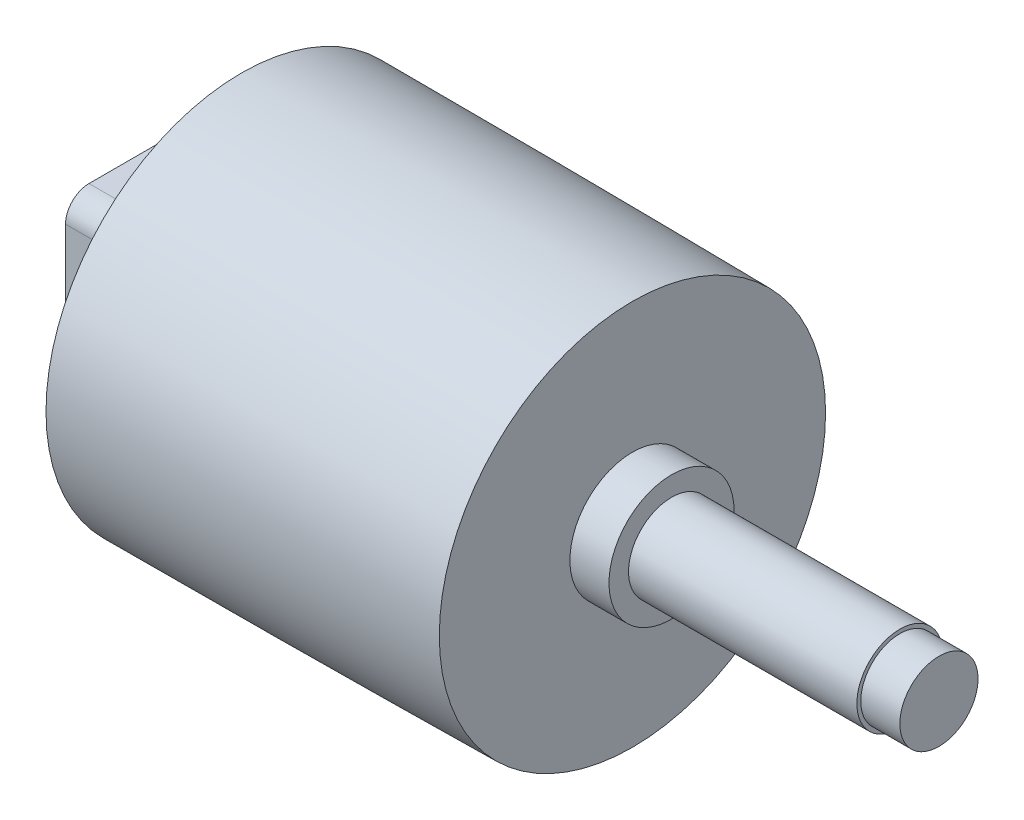
ISO-10303-21;
HEADER;
FILE_DESCRIPTION(('STEP AP214'),'2;1');
FILE_NAME('part.step','',(''),(''),'','','');
FILE_SCHEMA(('AUTOMOTIVE_DESIGN { 1 0 10303 214 1 1 1 1 }'));
ENDSEC;
DATA;
#1=APPLICATION_CONTEXT('core data for automotive mechanical design processes');
#2=APPLICATION_PROTOCOL_DEFINITION('international standard','automotive_design',2000,#1);
#3=PRODUCT_CONTEXT('',#1,'mechanical');
#4=PRODUCT('Part','Part','',(#3));
#5=PRODUCT_RELATED_PRODUCT_CATEGORY('part','',(#4));
#6=PRODUCT_DEFINITION_FORMATION('','',#4);
#7=PRODUCT_DEFINITION_CONTEXT('part definition',#1,'design');
#8=PRODUCT_DEFINITION('design','',#6,#7);
#9=PRODUCT_DEFINITION_SHAPE('','',#8);
#10=(LENGTH_UNIT() NAMED_UNIT(*) SI_UNIT(.MILLI.,.METRE.));
#11=(NAMED_UNIT(*) PLANE_ANGLE_UNIT() SI_UNIT($,.RADIAN.));
#12=(NAMED_UNIT(*) SI_UNIT($,.STERADIAN.) SOLID_ANGLE_UNIT());
#13=UNCERTAINTY_MEASURE_WITH_UNIT(LENGTH_MEASURE(1.E-05),#10,'distance_accuracy_value','');
#14=(GEOMETRIC_REPRESENTATION_CONTEXT(3) GLOBAL_UNCERTAINTY_ASSIGNED_CONTEXT((#13)) GLOBAL_UNIT_ASSIGNED_CONTEXT((#10,
#11,#12)) REPRESENTATION_CONTEXT('',''));
#15=CARTESIAN_POINT('',(0.,0.,0.));
#16=DIRECTION('',(0.,0.,1.));
#17=DIRECTION('',(1.,0.,0.));
#18=AXIS2_PLACEMENT_3D('',#15,#16,#17);
#19=CARTESIAN_POINT('',(-76.9950755436057,8.24786516853933,0.));
#20=DIRECTION('',(1.,0.,0.));
#21=DIRECTION('',(0.,0.,-1.));
#22=AXIS2_PLACEMENT_3D('',#19,#20,#21);
#23=PLANE('',#22);
#24=CARTESIAN_POINT('',(-76.9950755436057,8.24786516853933,0.));
#25=DIRECTION('',(1.,0.,0.));
#26=DIRECTION('',(0.,0.,-1.));
#27=AXIS2_PLACEMENT_3D('',#24,#25,#26);
#28=CIRCLE('',#27,25.);
#29=CARTESIAN_POINT('',(-76.9950755436057,8.24786516853933,-25.));
#30=VERTEX_POINT('',#29);
#31=EDGE_CURVE('E121',#30,#30,#28,.T.);
#32=ORIENTED_EDGE('',*,*,#31,.F.);
#33=EDGE_LOOP('',(#32));
#34=FACE_BOUND('',#33,.T.);
#35=CARTESIAN_POINT('',(-76.9950755436057,-1.25213483146068,9.50000000000001));
#36=DIRECTION('',(-1.,0.,0.));
#37=DIRECTION('',(0.,0.,1.));
#38=AXIS2_PLACEMENT_3D('',#35,#36,#37);
#39=CIRCLE('',#38,3.);
#40=CARTESIAN_POINT('',(-76.9950755436057,-4.25213483146068,9.49999999999998));
#41=VERTEX_POINT('',#40);
#42=CARTESIAN_POINT('',(-76.9950755436057,-1.25213483146065,12.5));
#43=VERTEX_POINT('',#42);
#44=EDGE_CURVE('E51',#41,#43,#39,.T.);
#45=ORIENTED_EDGE('',*,*,#44,.F.);
#46=DIRECTION('',(0.,0.,1.));
#47=VECTOR('',#46,1.);
#48=CARTESIAN_POINT('',(-76.9950755436057,-4.25213483146068,-9.49999999999998));
#49=LINE('',#48,#47);
#50=CARTESIAN_POINT('',(-76.9950755436057,-4.25213483146068,-9.49999999999998));
#51=VERTEX_POINT('',#50);
#52=EDGE_CURVE('E55',#51,#41,#49,.T.);
#53=ORIENTED_EDGE('',*,*,#52,.F.);
#54=CARTESIAN_POINT('',(-76.9950755436057,-1.25213483146068,-9.5));
#55=DIRECTION('',(-1.,0.,0.));
#56=DIRECTION('',(0.,0.,1.));
#57=AXIS2_PLACEMENT_3D('',#54,#55,#56);
#58=CIRCLE('',#57,3.);
#59=CARTESIAN_POINT('',(-76.9950755436057,-1.25213483146065,-12.5));
#60=VERTEX_POINT('',#59);
#61=EDGE_CURVE('E337',#60,#51,#58,.T.);
#62=ORIENTED_EDGE('',*,*,#61,.F.);
#63=DIRECTION('',(0.,-1.,0.));
#64=VECTOR('',#63,1.);
#65=CARTESIAN_POINT('',(-76.9950755436057,17.7478651685393,-12.5));
#66=LINE('',#65,#64);
#67=CARTESIAN_POINT('',(-76.9950755436057,17.7478651685393,-12.5));
#68=VERTEX_POINT('',#67);
#69=EDGE_CURVE('E371',#68,#60,#66,.T.);
#70=ORIENTED_EDGE('',*,*,#69,.F.);
#71=CARTESIAN_POINT('',(-76.9950755436057,17.7478651685393,-9.50000000000001));
#72=DIRECTION('',(-1.,0.,0.));
#73=DIRECTION('',(0.,0.,1.));
#74=AXIS2_PLACEMENT_3D('',#71,#72,#73);
#75=CIRCLE('',#74,3.);
#76=CARTESIAN_POINT('',(-76.9950755436057,20.7478651685393,-9.49999999999998));
#77=VERTEX_POINT('',#76);
#78=EDGE_CURVE('E364',#77,#68,#75,.T.);
#79=ORIENTED_EDGE('',*,*,#78,.F.);
#80=DIRECTION('',(0.,0.,-1.));
#81=VECTOR('',#80,1.);
#82=CARTESIAN_POINT('',(-76.9950755436057,20.7478651685393,-9.49999999999998));
#83=LINE('',#82,#81);
#84=CARTESIAN_POINT('',(-76.9950755436057,20.7478651685393,9.49999999999998));
#85=VERTEX_POINT('',#84);
#86=EDGE_CURVE('E358',#85,#77,#83,.T.);
#87=ORIENTED_EDGE('',*,*,#86,.F.);
#88=CARTESIAN_POINT('',(-76.9950755436057,17.7478651685393,9.5));
#89=DIRECTION('',(-1.,0.,0.));
#90=DIRECTION('',(0.,0.,-1.));
#91=AXIS2_PLACEMENT_3D('',#88,#89,#90);
#92=CIRCLE('',#91,3.);
#93=CARTESIAN_POINT('',(-76.9950755436057,17.7478651685393,12.5));
#94=VERTEX_POINT('',#93);
#95=EDGE_CURVE('E361',#94,#85,#92,.T.);
#96=ORIENTED_EDGE('',*,*,#95,.F.);
#97=DIRECTION('',(0.,1.,0.));
#98=VECTOR('',#97,1.);
#99=CARTESIAN_POINT('',(-76.9950755436057,17.7478651685393,12.5));
#100=LINE('',#99,#98);
#101=EDGE_CURVE('E362',#43,#94,#100,.T.);
#102=ORIENTED_EDGE('',*,*,#101,.F.);
#103=EDGE_LOOP('',(#45,#53,#62,#70,#79,#87,#96,#102));
#104=FACE_BOUND('',#103,.T.);
#105=ADVANCED_FACE('F35',(#34,#104),#23,.F.);
#106=CARTESIAN_POINT('',(-26.9950755436057,8.24786516853933,0.));
#107=DIRECTION('',(1.,0.,0.));
#108=DIRECTION('',(0.,0.617753922452919,-0.786371471566735));
#109=AXIS2_PLACEMENT_3D('',#106,#107,#108);
#110=CYLINDRICAL_SURFACE('',#109,5.5);
#111=CARTESIAN_POINT('',(7.20492445639428,8.24786516853933,0.));
#112=DIRECTION('',(-1.,0.,0.));
#113=DIRECTION('',(0.,-0.617753922452919,0.786371471566735));
#114=AXIS2_PLACEMENT_3D('',#111,#112,#113);
#115=CIRCLE('',#114,5.5);
#116=CARTESIAN_POINT('',(7.20492445639428,4.85021859504827,4.32504309361704));
#117=VERTEX_POINT('',#116);
#118=EDGE_CURVE('E139',#117,#117,#115,.T.);
#119=ORIENTED_EDGE('',*,*,#118,.T.);
#120=EDGE_LOOP('',(#119));
#121=FACE_BOUND('',#120,.T.);
#122=CARTESIAN_POINT('',(-21.9950755436057,8.24786516853933,0.));
#123=DIRECTION('',(-1.,0.,0.));
#124=DIRECTION('',(0.,-0.617753922452919,0.786371471566735));
#125=AXIS2_PLACEMENT_3D('',#122,#123,#124);
#126=CIRCLE('',#125,5.5);
#127=CARTESIAN_POINT('',(-21.9950755436057,4.85021859504827,4.32504309361704));
#128=VERTEX_POINT('',#127);
#129=EDGE_CURVE('E39',#128,#128,#126,.T.);
#130=ORIENTED_EDGE('',*,*,#129,.F.);
#131=EDGE_LOOP('',(#130));
#132=FACE_BOUND('',#131,.T.);
#133=ADVANCED_FACE('F37',(#121,#132),#110,.T.);
#134=CARTESIAN_POINT('',(7.20492445639428,8.24786516853933,0.));
#135=DIRECTION('',(-1.,0.,0.));
#136=DIRECTION('',(0.,-0.617753922452919,0.786371471566735));
#137=AXIS2_PLACEMENT_3D('',#134,#135,#136);
#138=PLANE('',#137);
#139=CARTESIAN_POINT('',(7.20492445639428,8.24786516853933,0.));
#140=DIRECTION('',(1.,0.,0.));
#141=DIRECTION('',(0.,0.617753922452919,-0.786371471566735));
#142=AXIS2_PLACEMENT_3D('',#139,#140,#141);
#143=CIRCLE('',#142,5.);
#144=CARTESIAN_POINT('',(7.20492445639428,11.3366347808039,-3.93185735783368));
#145=VERTEX_POINT('',#144);
#146=EDGE_CURVE('E11',#145,#145,#143,.T.);
#147=ORIENTED_EDGE('',*,*,#146,.F.);
#148=EDGE_LOOP('',(#147));
#149=FACE_BOUND('',#148,.T.);
#150=ORIENTED_EDGE('',*,*,#118,.F.);
#151=EDGE_LOOP('',(#150));
#152=FACE_BOUND('',#151,.T.);
#153=ADVANCED_FACE('F151',(#149,#152),#138,.F.);
#154=CARTESIAN_POINT('',(-21.9950755436057,8.24786516853933,0.));
#155=DIRECTION('',(-1.,0.,0.));
#156=DIRECTION('',(0.,-0.617753922452919,0.786371471566735));
#157=AXIS2_PLACEMENT_3D('',#154,#155,#156);
#158=CYLINDRICAL_SURFACE('',#157,8.);
#159=CARTESIAN_POINT('',(-21.9950755436057,8.24786516853933,0.));
#160=DIRECTION('',(-1.,0.,0.));
#161=DIRECTION('',(0.,-0.617753922452919,0.786371471566735));
#162=AXIS2_PLACEMENT_3D('',#159,#160,#161);
#163=CIRCLE('',#162,8.);
#164=CARTESIAN_POINT('',(-21.9950755436057,3.30583378891597,6.29097177253388));
#165=VERTEX_POINT('',#164);
#166=EDGE_CURVE('E136',#165,#165,#163,.T.);
#167=ORIENTED_EDGE('',*,*,#166,.T.);
#168=EDGE_LOOP('',(#167));
#169=FACE_BOUND('',#168,.T.);
#170=CARTESIAN_POINT('',(-26.9950755436057,8.24786516853933,0.));
#171=DIRECTION('',(-1.,0.,0.));
#172=DIRECTION('',(0.,-0.617753922452919,0.786371471566735));
#173=AXIS2_PLACEMENT_3D('',#170,#171,#172);
#174=CIRCLE('',#173,8.);
#175=CARTESIAN_POINT('',(-26.9950755436057,3.30583378891597,6.29097177253388));
#176=VERTEX_POINT('',#175);
#177=EDGE_CURVE('E134',#176,#176,#174,.T.);
#178=ORIENTED_EDGE('',*,*,#177,.F.);
#179=EDGE_LOOP('',(#178));
#180=FACE_BOUND('',#179,.T.);
#181=ADVANCED_FACE('F156',(#169,#180),#158,.T.);
#182=CARTESIAN_POINT('',(-21.9950755436057,8.24786516853933,0.));
#183=DIRECTION('',(-1.,0.,0.));
#184=DIRECTION('',(0.,-0.617753922452919,0.786371471566735));
#185=AXIS2_PLACEMENT_3D('',#182,#183,#184);
#186=PLANE('',#185);
#187=ORIENTED_EDGE('',*,*,#129,.T.);
#188=EDGE_LOOP('',(#187));
#189=FACE_BOUND('',#188,.T.);
#190=ORIENTED_EDGE('',*,*,#166,.F.);
#191=EDGE_LOOP('',(#190));
#192=FACE_BOUND('',#191,.T.);
#193=ADVANCED_FACE('F147',(#189,#192),#186,.F.);
#194=CARTESIAN_POINT('',(12.2049244563943,8.24786516853933,0.));
#195=DIRECTION('',(-1.,0.,0.));
#196=DIRECTION('',(0.,-0.617753922452919,0.786371471566735));
#197=AXIS2_PLACEMENT_3D('',#194,#195,#196);
#198=CYLINDRICAL_SURFACE('',#197,5.);
#199=CARTESIAN_POINT('',(12.2049244563943,8.24786516853933,0.));
#200=DIRECTION('',(1.,0.,0.));
#201=DIRECTION('',(0.,0.617753922452919,-0.786371471566735));
#202=AXIS2_PLACEMENT_3D('',#199,#200,#201);
#203=CIRCLE('',#202,5.);
#204=CARTESIAN_POINT('',(12.2049244563943,11.3366347808039,-3.93185735783368));
#205=VERTEX_POINT('',#204);
#206=EDGE_CURVE('E132',#205,#205,#203,.T.);
#207=ORIENTED_EDGE('',*,*,#206,.F.);
#208=EDGE_LOOP('',(#207));
#209=FACE_BOUND('',#208,.T.);
#210=ORIENTED_EDGE('',*,*,#146,.T.);
#211=EDGE_LOOP('',(#210));
#212=FACE_BOUND('',#211,.T.);
#213=ADVANCED_FACE('F173',(#209,#212),#198,.T.);
#214=CARTESIAN_POINT('',(12.2049244563943,8.24786516853933,0.));
#215=DIRECTION('',(1.,0.,0.));
#216=DIRECTION('',(0.,0.617753922452919,-0.786371471566735));
#217=AXIS2_PLACEMENT_3D('',#214,#215,#216);
#218=PLANE('',#217);
#219=ORIENTED_EDGE('',*,*,#206,.T.);
#220=EDGE_LOOP('',(#219));
#221=FACE_BOUND('',#220,.T.);
#222=ADVANCED_FACE('F170',(#221),#218,.T.);
#223=CARTESIAN_POINT('',(-26.9950755436057,30.2478651685393,0.));
#224=DIRECTION('',(-1.,0.,0.));
#225=DIRECTION('',(0.,0.,1.));
#226=AXIS2_PLACEMENT_3D('',#223,#224,#225);
#227=PLANE('',#226);
#228=ORIENTED_EDGE('',*,*,#177,.T.);
#229=EDGE_LOOP('',(#228));
#230=FACE_BOUND('',#229,.T.);
#231=CARTESIAN_POINT('',(-26.9950755436056,8.24786516853933,0.));
#232=DIRECTION('',(-1.,0.,0.));
#233=DIRECTION('',(0.,-1.,0.));
#234=AXIS2_PLACEMENT_3D('',#231,#232,#233);
#235=CIRCLE('',#234,24.7000000000002);
#236=CARTESIAN_POINT('',(-26.9950755436056,-16.4521348314608,0.));
#237=VERTEX_POINT('',#236);
#238=EDGE_CURVE('E124',#237,#237,#235,.T.);
#239=ORIENTED_EDGE('',*,*,#238,.F.);
#240=EDGE_LOOP('',(#239));
#241=FACE_BOUND('',#240,.T.);
#242=ADVANCED_FACE('F168',(#230,#241),#227,.F.);
#243=CARTESIAN_POINT('',(-76.9950755436057,8.24786516853933,0.));
#244=DIRECTION('',(-1.,0.,0.));
#245=DIRECTION('',(0.,-1.,0.));
#246=AXIS2_PLACEMENT_3D('',#243,#244,#245);
#247=DEGENERATE_TOROIDAL_SURFACE('',#246,4141.81666666664,4166.81666666664,.F.);
#248=ORIENTED_EDGE('',*,*,#31,.T.);
#249=EDGE_LOOP('',(#248));
#250=FACE_BOUND('',#249,.T.);
#251=ORIENTED_EDGE('',*,*,#238,.T.);
#252=EDGE_LOOP('',(#251));
#253=FACE_BOUND('',#252,.T.);
#254=ADVANCED_FACE('F191',(#250,#253),#247,.F.);
#255=CARTESIAN_POINT('',(-86.9950755436057,-1.25213483146068,9.50000000000001));
#256=DIRECTION('',(1.,0.,0.));
#257=DIRECTION('',(0.,0.,-1.));
#258=AXIS2_PLACEMENT_3D('',#255,#256,#257);
#259=CYLINDRICAL_SURFACE('',#258,3.);
#260=ORIENTED_EDGE('',*,*,#44,.T.);
#261=DIRECTION('',(1.,0.,0.));
#262=VECTOR('',#261,1.);
#263=CARTESIAN_POINT('',(-86.9950755436057,-1.25213483146065,12.5));
#264=LINE('',#263,#262);
#265=CARTESIAN_POINT('',(-86.9950755436057,-1.25213483146065,12.5));
#266=VERTEX_POINT('',#265);
#267=EDGE_CURVE('E104',#266,#43,#264,.T.);
#268=ORIENTED_EDGE('',*,*,#267,.F.);
#269=CARTESIAN_POINT('',(-86.9950755436057,-1.25213483146068,9.50000000000001));
#270=DIRECTION('',(-1.,0.,0.));
#271=DIRECTION('',(0.,0.,1.));
#272=AXIS2_PLACEMENT_3D('',#269,#270,#271);
#273=CIRCLE('',#272,3.);
#274=CARTESIAN_POINT('',(-86.9950755436057,-4.25213483146068,9.49999999999998));
#275=VERTEX_POINT('',#274);
#276=EDGE_CURVE('E110',#275,#266,#273,.T.);
#277=ORIENTED_EDGE('',*,*,#276,.F.);
#278=DIRECTION('',(1.,0.,0.));
#279=VECTOR('',#278,1.);
#280=CARTESIAN_POINT('',(-86.9950755436057,-4.25213483146068,9.49999999999998));
#281=LINE('',#280,#279);
#282=EDGE_CURVE('E334',#275,#41,#281,.T.);
#283=ORIENTED_EDGE('',*,*,#282,.T.);
#284=EDGE_LOOP('',(#260,#268,#277,#283));
#285=FACE_BOUND('',#284,.T.);
#286=ADVANCED_FACE('F120',(#285),#259,.T.);
#287=CARTESIAN_POINT('',(-86.9950755436057,17.7478651685393,12.5));
#288=DIRECTION('',(0.,0.,-1.));
#289=DIRECTION('',(0.,1.,0.));
#290=AXIS2_PLACEMENT_3D('',#287,#288,#289);
#291=PLANE('',#290);
#292=ORIENTED_EDGE('',*,*,#101,.T.);
#293=DIRECTION('',(1.,0.,0.));
#294=VECTOR('',#293,1.);
#295=CARTESIAN_POINT('',(-86.9950755436057,17.7478651685393,12.5));
#296=LINE('',#295,#294);
#297=CARTESIAN_POINT('',(-86.9950755436057,17.7478651685393,12.5));
#298=VERTEX_POINT('',#297);
#299=EDGE_CURVE('E106',#298,#94,#296,.T.);
#300=ORIENTED_EDGE('',*,*,#299,.F.);
#301=DIRECTION('',(0.,1.,0.));
#302=VECTOR('',#301,1.);
#303=CARTESIAN_POINT('',(-86.9950755436057,17.7478651685393,12.5));
#304=LINE('',#303,#302);
#305=EDGE_CURVE('E99',#266,#298,#304,.T.);
#306=ORIENTED_EDGE('',*,*,#305,.F.);
#307=ORIENTED_EDGE('',*,*,#267,.T.);
#308=EDGE_LOOP('',(#292,#300,#306,#307));
#309=FACE_BOUND('',#308,.T.);
#310=ADVANCED_FACE('F102',(#309),#291,.F.);
#311=CARTESIAN_POINT('',(-86.9950755436057,17.7478651685393,9.5));
#312=DIRECTION('',(1.,0.,0.));
#313=DIRECTION('',(0.,0.,-1.));
#314=AXIS2_PLACEMENT_3D('',#311,#312,#313);
#315=CYLINDRICAL_SURFACE('',#314,3.);
#316=ORIENTED_EDGE('',*,*,#95,.T.);
#317=DIRECTION('',(1.,0.,0.));
#318=VECTOR('',#317,1.);
#319=CARTESIAN_POINT('',(-86.9950755436057,20.7478651685393,9.49999999999998));
#320=LINE('',#319,#318);
#321=CARTESIAN_POINT('',(-86.9950755436057,20.7478651685393,9.49999999999998));
#322=VERTEX_POINT('',#321);
#323=EDGE_CURVE('E126',#322,#85,#320,.T.);
#324=ORIENTED_EDGE('',*,*,#323,.F.);
#325=CARTESIAN_POINT('',(-86.9950755436057,17.7478651685393,9.5));
#326=DIRECTION('',(-1.,0.,0.));
#327=DIRECTION('',(0.,0.,-1.));
#328=AXIS2_PLACEMENT_3D('',#325,#326,#327);
#329=CIRCLE('',#328,3.);
#330=EDGE_CURVE('E109',#298,#322,#329,.T.);
#331=ORIENTED_EDGE('',*,*,#330,.F.);
#332=ORIENTED_EDGE('',*,*,#299,.T.);
#333=EDGE_LOOP('',(#316,#324,#331,#332));
#334=FACE_BOUND('',#333,.T.);
#335=ADVANCED_FACE('F202',(#334),#315,.T.);
#336=CARTESIAN_POINT('',(-86.9950755436057,20.7478651685393,-9.49999999999998));
#337=DIRECTION('',(0.,-1.,0.));
#338=DIRECTION('',(0.,0.,-1.));
#339=AXIS2_PLACEMENT_3D('',#336,#337,#338);
#340=PLANE('',#339);
#341=ORIENTED_EDGE('',*,*,#86,.T.);
#342=DIRECTION('',(1.,0.,0.));
#343=VECTOR('',#342,1.);
#344=CARTESIAN_POINT('',(-86.9950755436057,20.7478651685393,-9.49999999999998));
#345=LINE('',#344,#343);
#346=CARTESIAN_POINT('',(-86.9950755436057,20.7478651685393,-9.49999999999998));
#347=VERTEX_POINT('',#346);
#348=EDGE_CURVE('E351',#347,#77,#345,.T.);
#349=ORIENTED_EDGE('',*,*,#348,.F.);
#350=DIRECTION('',(0.,0.,-1.));
#351=VECTOR('',#350,1.);
#352=CARTESIAN_POINT('',(-86.9950755436057,20.7478651685393,-9.49999999999998));
#353=LINE('',#352,#351);
#354=EDGE_CURVE('E359',#322,#347,#353,.T.);
#355=ORIENTED_EDGE('',*,*,#354,.F.);
#356=ORIENTED_EDGE('',*,*,#323,.T.);
#357=EDGE_LOOP('',(#341,#349,#355,#356));
#358=FACE_BOUND('',#357,.T.);
#359=ADVANCED_FACE('F205',(#358),#340,.F.);
#360=CARTESIAN_POINT('',(-86.9950755436057,17.7478651685393,-9.50000000000001));
#361=DIRECTION('',(1.,0.,0.));
#362=DIRECTION('',(0.,0.,-1.));
#363=AXIS2_PLACEMENT_3D('',#360,#361,#362);
#364=CYLINDRICAL_SURFACE('',#363,3.);
#365=ORIENTED_EDGE('',*,*,#78,.T.);
#366=DIRECTION('',(1.,0.,0.));
#367=VECTOR('',#366,1.);
#368=CARTESIAN_POINT('',(-86.9950755436057,17.7478651685393,-12.5));
#369=LINE('',#368,#367);
#370=CARTESIAN_POINT('',(-86.9950755436057,17.7478651685393,-12.5));
#371=VERTEX_POINT('',#370);
#372=EDGE_CURVE('E348',#371,#68,#369,.T.);
#373=ORIENTED_EDGE('',*,*,#372,.F.);
#374=CARTESIAN_POINT('',(-86.9950755436057,17.7478651685393,-9.50000000000001));
#375=DIRECTION('',(-1.,0.,0.));
#376=DIRECTION('',(0.,0.,1.));
#377=AXIS2_PLACEMENT_3D('',#374,#375,#376);
#378=CIRCLE('',#377,3.);
#379=EDGE_CURVE('E379',#347,#371,#378,.T.);
#380=ORIENTED_EDGE('',*,*,#379,.F.);
#381=ORIENTED_EDGE('',*,*,#348,.T.);
#382=EDGE_LOOP('',(#365,#373,#380,#381));
#383=FACE_BOUND('',#382,.T.);
#384=ADVANCED_FACE('F209',(#383),#364,.T.);
#385=CARTESIAN_POINT('',(-86.9950755436057,17.7478651685393,-12.5));
#386=DIRECTION('',(0.,0.,1.));
#387=DIRECTION('',(0.,-1.,0.));
#388=AXIS2_PLACEMENT_3D('',#385,#386,#387);
#389=PLANE('',#388);
#390=ORIENTED_EDGE('',*,*,#69,.T.);
#391=DIRECTION('',(1.,0.,0.));
#392=VECTOR('',#391,1.);
#393=CARTESIAN_POINT('',(-86.9950755436057,-1.25213483146065,-12.5));
#394=LINE('',#393,#392);
#395=CARTESIAN_POINT('',(-86.9950755436057,-1.25213483146065,-12.5));
#396=VERTEX_POINT('',#395);
#397=EDGE_CURVE('E340',#396,#60,#394,.T.);
#398=ORIENTED_EDGE('',*,*,#397,.F.);
#399=DIRECTION('',(0.,-1.,0.));
#400=VECTOR('',#399,1.);
#401=CARTESIAN_POINT('',(-86.9950755436057,17.7478651685393,-12.5));
#402=LINE('',#401,#400);
#403=EDGE_CURVE('E377',#371,#396,#402,.T.);
#404=ORIENTED_EDGE('',*,*,#403,.F.);
#405=ORIENTED_EDGE('',*,*,#372,.T.);
#406=EDGE_LOOP('',(#390,#398,#404,#405));
#407=FACE_BOUND('',#406,.T.);
#408=ADVANCED_FACE('F213',(#407),#389,.F.);
#409=CARTESIAN_POINT('',(-86.9950755436057,-1.25213483146068,-9.5));
#410=DIRECTION('',(1.,0.,0.));
#411=DIRECTION('',(0.,0.,-1.));
#412=AXIS2_PLACEMENT_3D('',#409,#410,#411);
#413=CYLINDRICAL_SURFACE('',#412,3.);
#414=ORIENTED_EDGE('',*,*,#61,.T.);
#415=DIRECTION('',(1.,0.,0.));
#416=VECTOR('',#415,1.);
#417=CARTESIAN_POINT('',(-86.9950755436057,-4.25213483146068,-9.49999999999998));
#418=LINE('',#417,#416);
#419=CARTESIAN_POINT('',(-86.9950755436057,-4.25213483146068,-9.49999999999998));
#420=VERTEX_POINT('',#419);
#421=EDGE_CURVE('E336',#420,#51,#418,.T.);
#422=ORIENTED_EDGE('',*,*,#421,.F.);
#423=CARTESIAN_POINT('',(-86.9950755436057,-1.25213483146068,-9.5));
#424=DIRECTION('',(-1.,0.,0.));
#425=DIRECTION('',(0.,0.,1.));
#426=AXIS2_PLACEMENT_3D('',#423,#424,#425);
#427=CIRCLE('',#426,3.);
#428=EDGE_CURVE('E342',#396,#420,#427,.T.);
#429=ORIENTED_EDGE('',*,*,#428,.F.);
#430=ORIENTED_EDGE('',*,*,#397,.T.);
#431=EDGE_LOOP('',(#414,#422,#429,#430));
#432=FACE_BOUND('',#431,.T.);
#433=ADVANCED_FACE('F217',(#432),#413,.T.);
#434=CARTESIAN_POINT('',(-86.9950755436057,-4.25213483146068,-9.49999999999998));
#435=DIRECTION('',(0.,1.,0.));
#436=DIRECTION('',(0.,0.,1.));
#437=AXIS2_PLACEMENT_3D('',#434,#435,#436);
#438=PLANE('',#437);
#439=ORIENTED_EDGE('',*,*,#52,.T.);
#440=ORIENTED_EDGE('',*,*,#282,.F.);
#441=DIRECTION('',(0.,0.,1.));
#442=VECTOR('',#441,1.);
#443=CARTESIAN_POINT('',(-86.9950755436057,-4.25213483146068,-9.49999999999998));
#444=LINE('',#443,#442);
#445=EDGE_CURVE('E115',#420,#275,#444,.T.);
#446=ORIENTED_EDGE('',*,*,#445,.F.);
#447=ORIENTED_EDGE('',*,*,#421,.T.);
#448=EDGE_LOOP('',(#439,#440,#446,#447));
#449=FACE_BOUND('',#448,.T.);
#450=ADVANCED_FACE('F221',(#449),#438,.F.);
#451=CARTESIAN_POINT('',(-86.9950755436057,-1.25213483146068,9.50000000000001));
#452=DIRECTION('',(-1.,0.,0.));
#453=DIRECTION('',(0.,0.,1.));
#454=AXIS2_PLACEMENT_3D('',#451,#452,#453);
#455=PLANE('',#454);
#456=ORIENTED_EDGE('',*,*,#276,.T.);
#457=ORIENTED_EDGE('',*,*,#305,.T.);
#458=ORIENTED_EDGE('',*,*,#330,.T.);
#459=ORIENTED_EDGE('',*,*,#354,.T.);
#460=ORIENTED_EDGE('',*,*,#379,.T.);
#461=ORIENTED_EDGE('',*,*,#403,.T.);
#462=ORIENTED_EDGE('',*,*,#428,.T.);
#463=ORIENTED_EDGE('',*,*,#445,.T.);
#464=EDGE_LOOP('',(#456,#457,#458,#459,#460,#461,#462,#463));
#465=FACE_BOUND('',#464,.T.);
#466=ADVANCED_FACE('F113',(#465),#455,.T.);
#467=CLOSED_SHELL('',(#105,#133,#153,#181,#193,#213,#222,#242,#254,#286,#310,#335,#359,#384,
#408,#433,#450,#466));
#468=MANIFOLD_SOLID_BREP('B2',#467);
#469=ADVANCED_BREP_SHAPE_REPRESENTATION('',(#18,#468),#14);
#470=SHAPE_DEFINITION_REPRESENTATION(#9,#469);
ENDSEC;
END-ISO-10303-21;
